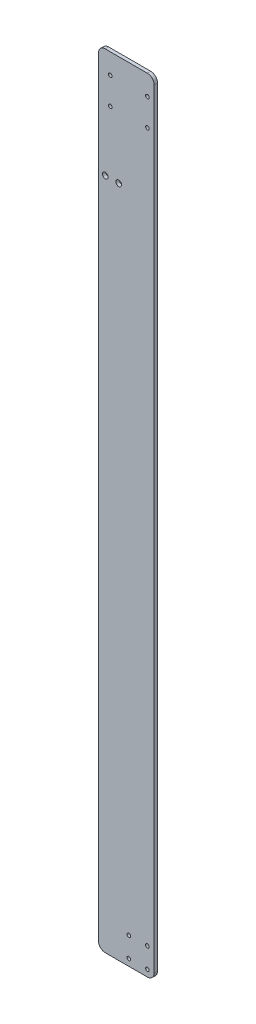
ISO-10303-21;
HEADER;
FILE_DESCRIPTION(('STEP AP214'),'2;1');
FILE_NAME('part.step','',(''),(''),'','','');
FILE_SCHEMA(('AUTOMOTIVE_DESIGN { 1 0 10303 214 1 1 1 1 }'));
ENDSEC;
DATA;
#1=APPLICATION_CONTEXT('core data for automotive mechanical design processes');
#2=APPLICATION_PROTOCOL_DEFINITION('international standard','automotive_design',2000,#1);
#3=PRODUCT_CONTEXT('',#1,'mechanical');
#4=PRODUCT('Part','Part','',(#3));
#5=PRODUCT_RELATED_PRODUCT_CATEGORY('part','',(#4));
#6=PRODUCT_DEFINITION_FORMATION('','',#4);
#7=PRODUCT_DEFINITION_CONTEXT('part definition',#1,'design');
#8=PRODUCT_DEFINITION('design','',#6,#7);
#9=PRODUCT_DEFINITION_SHAPE('','',#8);
#10=(LENGTH_UNIT() NAMED_UNIT(*) SI_UNIT(.MILLI.,.METRE.));
#11=(NAMED_UNIT(*) PLANE_ANGLE_UNIT() SI_UNIT($,.RADIAN.));
#12=(NAMED_UNIT(*) SI_UNIT($,.STERADIAN.) SOLID_ANGLE_UNIT());
#13=UNCERTAINTY_MEASURE_WITH_UNIT(LENGTH_MEASURE(1.E-05),#10,'distance_accuracy_value','');
#14=(GEOMETRIC_REPRESENTATION_CONTEXT(3) GLOBAL_UNCERTAINTY_ASSIGNED_CONTEXT((#13)) GLOBAL_UNIT_ASSIGNED_CONTEXT((#10,
#11,#12)) REPRESENTATION_CONTEXT('',''));
#15=CARTESIAN_POINT('',(0.,0.,0.));
#16=DIRECTION('',(0.,0.,1.));
#17=DIRECTION('',(1.,0.,0.));
#18=AXIS2_PLACEMENT_3D('',#15,#16,#17);
#19=CARTESIAN_POINT('',(12.7,1460.5,6.35));
#20=DIRECTION('',(0.,0.,-1.));
#21=DIRECTION('',(-1.,0.,0.));
#22=AXIS2_PLACEMENT_3D('',#19,#20,#21);
#23=PLANE('',#22);
#24=CARTESIAN_POINT('',(12.7,1460.5,6.35));
#25=DIRECTION('',(0.,0.,1.));
#26=DIRECTION('',(-1.,0.,0.));
#27=AXIS2_PLACEMENT_3D('',#24,#25,#26);
#28=CIRCLE('',#27,12.7);
#29=CARTESIAN_POINT('',(12.7,1473.2,6.35));
#30=VERTEX_POINT('',#29);
#31=CARTESIAN_POINT('',(0.,1460.5,6.35));
#32=VERTEX_POINT('',#31);
#33=EDGE_CURVE('E147',#30,#32,#28,.T.);
#34=ORIENTED_EDGE('',*,*,#33,.T.);
#35=DIRECTION('',(0.,-1.,0.));
#36=VECTOR('',#35,1.);
#37=CARTESIAN_POINT('',(0.,12.7000000000001,6.35));
#38=LINE('',#37,#36);
#39=CARTESIAN_POINT('',(0.,12.7000000000001,6.35));
#40=VERTEX_POINT('',#39);
#41=EDGE_CURVE('E95',#32,#40,#38,.T.);
#42=ORIENTED_EDGE('',*,*,#41,.T.);
#43=CARTESIAN_POINT('',(12.7,12.7,6.35));
#44=DIRECTION('',(0.,0.,1.));
#45=DIRECTION('',(-1.,0.,0.));
#46=AXIS2_PLACEMENT_3D('',#43,#44,#45);
#47=CIRCLE('',#46,12.7);
#48=CARTESIAN_POINT('',(12.7000000000001,0.,6.35));
#49=VERTEX_POINT('',#48);
#50=EDGE_CURVE('E162',#40,#49,#47,.T.);
#51=ORIENTED_EDGE('',*,*,#50,.T.);
#52=DIRECTION('',(1.,0.,0.));
#53=VECTOR('',#52,1.);
#54=CARTESIAN_POINT('',(12.7000000000001,0.,6.35));
#55=LINE('',#54,#53);
#56=CARTESIAN_POINT('',(92.0749999999999,0.,6.35));
#57=VERTEX_POINT('',#56);
#58=EDGE_CURVE('E175',#49,#57,#55,.T.);
#59=ORIENTED_EDGE('',*,*,#58,.T.);
#60=CARTESIAN_POINT('',(92.075,12.7,6.35));
#61=DIRECTION('',(0.,0.,1.));
#62=DIRECTION('',(1.,0.,0.));
#63=AXIS2_PLACEMENT_3D('',#60,#61,#62);
#64=CIRCLE('',#63,12.7);
#65=CARTESIAN_POINT('',(104.775,12.7,6.35));
#66=VERTEX_POINT('',#65);
#67=EDGE_CURVE('E114',#57,#66,#64,.T.);
#68=ORIENTED_EDGE('',*,*,#67,.T.);
#69=DIRECTION('',(0.,1.,0.));
#70=VECTOR('',#69,1.);
#71=CARTESIAN_POINT('',(104.775,12.7000000000001,6.35));
#72=LINE('',#71,#70);
#73=CARTESIAN_POINT('',(104.775,1460.5,6.35));
#74=VERTEX_POINT('',#73);
#75=EDGE_CURVE('E108',#66,#74,#72,.T.);
#76=ORIENTED_EDGE('',*,*,#75,.T.);
#77=CARTESIAN_POINT('',(92.075,1460.5,6.35));
#78=DIRECTION('',(0.,0.,1.));
#79=DIRECTION('',(-1.,0.,0.));
#80=AXIS2_PLACEMENT_3D('',#77,#78,#79);
#81=CIRCLE('',#80,12.7);
#82=CARTESIAN_POINT('',(92.075,1473.2,6.35));
#83=VERTEX_POINT('',#82);
#84=EDGE_CURVE('E112',#74,#83,#81,.T.);
#85=ORIENTED_EDGE('',*,*,#84,.T.);
#86=DIRECTION('',(-1.,0.,0.));
#87=VECTOR('',#86,1.);
#88=CARTESIAN_POINT('',(12.7,1473.2,6.35));
#89=LINE('',#88,#87);
#90=EDGE_CURVE('E52',#83,#30,#89,.T.);
#91=ORIENTED_EDGE('',*,*,#90,.T.);
#92=EDGE_LOOP('',(#34,#42,#51,#59,#68,#76,#85,#91));
#93=FACE_BOUND('',#92,.T.);
#94=CARTESIAN_POINT('',(92.075,1435.1,6.35));
#95=DIRECTION('',(0.,0.,1.));
#96=DIRECTION('',(1.,0.,0.));
#97=AXIS2_PLACEMENT_3D('',#94,#95,#96);
#98=CIRCLE('',#97,3.429);
#99=CARTESIAN_POINT('',(95.504,1435.1,6.35));
#100=VERTEX_POINT('',#99);
#101=EDGE_CURVE('E136',#100,#100,#98,.T.);
#102=ORIENTED_EDGE('',*,*,#101,.F.);
#103=EDGE_LOOP('',(#102));
#104=FACE_BOUND('',#103,.T.);
#105=CARTESIAN_POINT('',(92.075,1384.3,6.35));
#106=DIRECTION('',(0.,0.,1.));
#107=DIRECTION('',(1.,0.,0.));
#108=AXIS2_PLACEMENT_3D('',#105,#106,#107);
#109=CIRCLE('',#108,3.429);
#110=CARTESIAN_POINT('',(95.504,1384.3,6.35));
#111=VERTEX_POINT('',#110);
#112=EDGE_CURVE('E184',#111,#111,#109,.T.);
#113=ORIENTED_EDGE('',*,*,#112,.F.);
#114=EDGE_LOOP('',(#113));
#115=FACE_BOUND('',#114,.T.);
#116=CARTESIAN_POINT('',(22.225,1384.3,6.35));
#117=DIRECTION('',(0.,0.,1.));
#118=DIRECTION('',(1.,0.,0.));
#119=AXIS2_PLACEMENT_3D('',#116,#117,#118);
#120=CIRCLE('',#119,3.429);
#121=CARTESIAN_POINT('',(25.654,1384.3,6.35));
#122=VERTEX_POINT('',#121);
#123=EDGE_CURVE('E190',#122,#122,#120,.T.);
#124=ORIENTED_EDGE('',*,*,#123,.F.);
#125=EDGE_LOOP('',(#124));
#126=FACE_BOUND('',#125,.T.);
#127=CARTESIAN_POINT('',(22.225,1435.1,6.35));
#128=DIRECTION('',(0.,0.,1.));
#129=DIRECTION('',(1.,0.,0.));
#130=AXIS2_PLACEMENT_3D('',#127,#128,#129);
#131=CIRCLE('',#130,3.429);
#132=CARTESIAN_POINT('',(25.654,1435.1,6.35));
#133=VERTEX_POINT('',#132);
#134=EDGE_CURVE('E196',#133,#133,#131,.T.);
#135=ORIENTED_EDGE('',*,*,#134,.F.);
#136=EDGE_LOOP('',(#135));
#137=FACE_BOUND('',#136,.T.);
#138=CARTESIAN_POINT('',(57.15,50.7999999999998,6.35));
#139=DIRECTION('',(0.,0.,1.));
#140=DIRECTION('',(1.,0.,0.));
#141=AXIS2_PLACEMENT_3D('',#138,#139,#140);
#142=CIRCLE('',#141,3.429);
#143=CARTESIAN_POINT('',(60.579,50.7999999999998,6.35));
#144=VERTEX_POINT('',#143);
#145=EDGE_CURVE('E202',#144,#144,#142,.T.);
#146=ORIENTED_EDGE('',*,*,#145,.F.);
#147=EDGE_LOOP('',(#146));
#148=FACE_BOUND('',#147,.T.);
#149=CARTESIAN_POINT('',(92.075,50.8,6.35));
#150=DIRECTION('',(0.,0.,1.));
#151=DIRECTION('',(1.,0.,0.));
#152=AXIS2_PLACEMENT_3D('',#149,#150,#151);
#153=CIRCLE('',#152,3.429);
#154=CARTESIAN_POINT('',(95.504,50.8,6.35));
#155=VERTEX_POINT('',#154);
#156=EDGE_CURVE('E208',#155,#155,#153,.T.);
#157=ORIENTED_EDGE('',*,*,#156,.F.);
#158=EDGE_LOOP('',(#157));
#159=FACE_BOUND('',#158,.T.);
#160=CARTESIAN_POINT('',(57.15,12.7,6.35));
#161=DIRECTION('',(0.,0.,1.));
#162=DIRECTION('',(1.,0.,0.));
#163=AXIS2_PLACEMENT_3D('',#160,#161,#162);
#164=CIRCLE('',#163,3.42899999999999);
#165=CARTESIAN_POINT('',(60.579,12.7,6.35));
#166=VERTEX_POINT('',#165);
#167=EDGE_CURVE('E214',#166,#166,#164,.T.);
#168=ORIENTED_EDGE('',*,*,#167,.F.);
#169=EDGE_LOOP('',(#168));
#170=FACE_BOUND('',#169,.T.);
#171=CARTESIAN_POINT('',(92.075,12.7,6.35));
#172=DIRECTION('',(0.,0.,1.));
#173=DIRECTION('',(1.,0.,0.));
#174=AXIS2_PLACEMENT_3D('',#171,#172,#173);
#175=CIRCLE('',#174,3.429);
#176=CARTESIAN_POINT('',(95.504,12.7,6.35));
#177=VERTEX_POINT('',#176);
#178=EDGE_CURVE('E220',#177,#177,#175,.T.);
#179=ORIENTED_EDGE('',*,*,#178,.F.);
#180=EDGE_LOOP('',(#179));
#181=FACE_BOUND('',#180,.T.);
#182=CARTESIAN_POINT('',(38.1,1266.825,6.35));
#183=DIRECTION('',(0.,0.,1.));
#184=DIRECTION('',(1.,0.,0.));
#185=AXIS2_PLACEMENT_3D('',#182,#183,#184);
#186=CIRCLE('',#185,5.3578124999999);
#187=CARTESIAN_POINT('',(43.4578124999999,1266.825,6.35));
#188=VERTEX_POINT('',#187);
#189=EDGE_CURVE('E226',#188,#188,#186,.T.);
#190=ORIENTED_EDGE('',*,*,#189,.F.);
#191=EDGE_LOOP('',(#190));
#192=FACE_BOUND('',#191,.T.);
#193=CARTESIAN_POINT('',(12.7,1266.825,6.35));
#194=DIRECTION('',(0.,0.,1.));
#195=DIRECTION('',(1.,0.,0.));
#196=AXIS2_PLACEMENT_3D('',#193,#194,#195);
#197=CIRCLE('',#196,5.35781249999991);
#198=CARTESIAN_POINT('',(18.0578124999999,1266.825,6.35));
#199=VERTEX_POINT('',#198);
#200=EDGE_CURVE('E232',#199,#199,#197,.T.);
#201=ORIENTED_EDGE('',*,*,#200,.F.);
#202=EDGE_LOOP('',(#201));
#203=FACE_BOUND('',#202,.T.);
#204=ADVANCED_FACE('F35',(#93,#104,#115,#126,#137,#148,#159,#170,#181,#192,#203),#23,.F.);
#205=CARTESIAN_POINT('',(12.7,1460.5,0.));
#206=DIRECTION('',(0.,0.,-1.));
#207=DIRECTION('',(-1.,0.,0.));
#208=AXIS2_PLACEMENT_3D('',#205,#206,#207);
#209=PLANE('',#208);
#210=CARTESIAN_POINT('',(38.1,1266.825,0.));
#211=DIRECTION('',(0.,0.,1.));
#212=DIRECTION('',(1.,0.,0.));
#213=AXIS2_PLACEMENT_3D('',#210,#211,#212);
#214=CIRCLE('',#213,5.3578124999999);
#215=CARTESIAN_POINT('',(43.4578124999999,1266.825,0.));
#216=VERTEX_POINT('',#215);
#217=EDGE_CURVE('E229',#216,#216,#214,.T.);
#218=ORIENTED_EDGE('',*,*,#217,.T.);
#219=EDGE_LOOP('',(#218));
#220=FACE_BOUND('',#219,.T.);
#221=CARTESIAN_POINT('',(57.15,12.7,0.));
#222=DIRECTION('',(0.,0.,1.));
#223=DIRECTION('',(1.,0.,0.));
#224=AXIS2_PLACEMENT_3D('',#221,#222,#223);
#225=CIRCLE('',#224,3.42899999999999);
#226=CARTESIAN_POINT('',(60.579,12.7,0.));
#227=VERTEX_POINT('',#226);
#228=EDGE_CURVE('E217',#227,#227,#225,.T.);
#229=ORIENTED_EDGE('',*,*,#228,.T.);
#230=EDGE_LOOP('',(#229));
#231=FACE_BOUND('',#230,.T.);
#232=CARTESIAN_POINT('',(57.15,50.7999999999998,0.));
#233=DIRECTION('',(0.,0.,1.));
#234=DIRECTION('',(1.,0.,0.));
#235=AXIS2_PLACEMENT_3D('',#232,#233,#234);
#236=CIRCLE('',#235,3.429);
#237=CARTESIAN_POINT('',(60.579,50.7999999999998,0.));
#238=VERTEX_POINT('',#237);
#239=EDGE_CURVE('E205',#238,#238,#236,.T.);
#240=ORIENTED_EDGE('',*,*,#239,.T.);
#241=EDGE_LOOP('',(#240));
#242=FACE_BOUND('',#241,.T.);
#243=CARTESIAN_POINT('',(22.225,1384.3,0.));
#244=DIRECTION('',(0.,0.,1.));
#245=DIRECTION('',(1.,0.,0.));
#246=AXIS2_PLACEMENT_3D('',#243,#244,#245);
#247=CIRCLE('',#246,3.429);
#248=CARTESIAN_POINT('',(25.654,1384.3,0.));
#249=VERTEX_POINT('',#248);
#250=EDGE_CURVE('E193',#249,#249,#247,.T.);
#251=ORIENTED_EDGE('',*,*,#250,.T.);
#252=EDGE_LOOP('',(#251));
#253=FACE_BOUND('',#252,.T.);
#254=CARTESIAN_POINT('',(92.075,1435.1,0.));
#255=DIRECTION('',(0.,0.,1.));
#256=DIRECTION('',(1.,0.,0.));
#257=AXIS2_PLACEMENT_3D('',#254,#255,#256);
#258=CIRCLE('',#257,3.429);
#259=CARTESIAN_POINT('',(95.504,1435.1,0.));
#260=VERTEX_POINT('',#259);
#261=EDGE_CURVE('E181',#260,#260,#258,.T.);
#262=ORIENTED_EDGE('',*,*,#261,.T.);
#263=EDGE_LOOP('',(#262));
#264=FACE_BOUND('',#263,.T.);
#265=CARTESIAN_POINT('',(12.7,1460.5,0.));
#266=DIRECTION('',(0.,0.,1.));
#267=DIRECTION('',(-1.,0.,0.));
#268=AXIS2_PLACEMENT_3D('',#265,#266,#267);
#269=CIRCLE('',#268,12.7);
#270=CARTESIAN_POINT('',(12.7,1473.2,0.));
#271=VERTEX_POINT('',#270);
#272=CARTESIAN_POINT('',(0.,1460.5,0.));
#273=VERTEX_POINT('',#272);
#274=EDGE_CURVE('E132',#271,#273,#269,.T.);
#275=ORIENTED_EDGE('',*,*,#274,.F.);
#276=DIRECTION('',(-1.,0.,0.));
#277=VECTOR('',#276,1.);
#278=CARTESIAN_POINT('',(12.7,1473.2,0.));
#279=LINE('',#278,#277);
#280=CARTESIAN_POINT('',(92.075,1473.2,0.));
#281=VERTEX_POINT('',#280);
#282=EDGE_CURVE('E87',#281,#271,#279,.T.);
#283=ORIENTED_EDGE('',*,*,#282,.F.);
#284=CARTESIAN_POINT('',(92.075,1460.5,0.));
#285=DIRECTION('',(0.,0.,1.));
#286=DIRECTION('',(-1.,0.,0.));
#287=AXIS2_PLACEMENT_3D('',#284,#285,#286);
#288=CIRCLE('',#287,12.7);
#289=CARTESIAN_POINT('',(104.775,1460.5,0.));
#290=VERTEX_POINT('',#289);
#291=EDGE_CURVE('E81',#290,#281,#288,.T.);
#292=ORIENTED_EDGE('',*,*,#291,.F.);
#293=DIRECTION('',(0.,1.,0.));
#294=VECTOR('',#293,1.);
#295=CARTESIAN_POINT('',(104.775,12.7000000000001,0.));
#296=LINE('',#295,#294);
#297=CARTESIAN_POINT('',(104.775,12.7,0.));
#298=VERTEX_POINT('',#297);
#299=EDGE_CURVE('E122',#298,#290,#296,.T.);
#300=ORIENTED_EDGE('',*,*,#299,.F.);
#301=CARTESIAN_POINT('',(92.075,12.7,0.));
#302=DIRECTION('',(0.,0.,1.));
#303=DIRECTION('',(1.,0.,0.));
#304=AXIS2_PLACEMENT_3D('',#301,#302,#303);
#305=CIRCLE('',#304,12.7);
#306=CARTESIAN_POINT('',(92.0749999999999,0.,0.));
#307=VERTEX_POINT('',#306);
#308=EDGE_CURVE('E142',#307,#298,#305,.T.);
#309=ORIENTED_EDGE('',*,*,#308,.F.);
#310=DIRECTION('',(1.,0.,0.));
#311=VECTOR('',#310,1.);
#312=CARTESIAN_POINT('',(12.7000000000001,0.,0.));
#313=LINE('',#312,#311);
#314=CARTESIAN_POINT('',(12.7000000000001,0.,0.));
#315=VERTEX_POINT('',#314);
#316=EDGE_CURVE('E140',#315,#307,#313,.T.);
#317=ORIENTED_EDGE('',*,*,#316,.F.);
#318=CARTESIAN_POINT('',(12.7,12.7,0.));
#319=DIRECTION('',(0.,0.,1.));
#320=DIRECTION('',(-1.,0.,0.));
#321=AXIS2_PLACEMENT_3D('',#318,#319,#320);
#322=CIRCLE('',#321,12.7);
#323=CARTESIAN_POINT('',(0.,12.7000000000001,0.));
#324=VERTEX_POINT('',#323);
#325=EDGE_CURVE('E138',#324,#315,#322,.T.);
#326=ORIENTED_EDGE('',*,*,#325,.F.);
#327=DIRECTION('',(0.,-1.,0.));
#328=VECTOR('',#327,1.);
#329=CARTESIAN_POINT('',(0.,12.7000000000001,0.));
#330=LINE('',#329,#328);
#331=EDGE_CURVE('E135',#273,#324,#330,.T.);
#332=ORIENTED_EDGE('',*,*,#331,.F.);
#333=EDGE_LOOP('',(#275,#283,#292,#300,#309,#317,#326,#332));
#334=FACE_BOUND('',#333,.T.);
#335=CARTESIAN_POINT('',(92.075,1384.3,0.));
#336=DIRECTION('',(0.,0.,1.));
#337=DIRECTION('',(1.,0.,0.));
#338=AXIS2_PLACEMENT_3D('',#335,#336,#337);
#339=CIRCLE('',#338,3.429);
#340=CARTESIAN_POINT('',(95.504,1384.3,0.));
#341=VERTEX_POINT('',#340);
#342=EDGE_CURVE('E187',#341,#341,#339,.T.);
#343=ORIENTED_EDGE('',*,*,#342,.T.);
#344=EDGE_LOOP('',(#343));
#345=FACE_BOUND('',#344,.T.);
#346=CARTESIAN_POINT('',(22.225,1435.1,0.));
#347=DIRECTION('',(0.,0.,1.));
#348=DIRECTION('',(1.,0.,0.));
#349=AXIS2_PLACEMENT_3D('',#346,#347,#348);
#350=CIRCLE('',#349,3.429);
#351=CARTESIAN_POINT('',(25.654,1435.1,0.));
#352=VERTEX_POINT('',#351);
#353=EDGE_CURVE('E199',#352,#352,#350,.T.);
#354=ORIENTED_EDGE('',*,*,#353,.T.);
#355=EDGE_LOOP('',(#354));
#356=FACE_BOUND('',#355,.T.);
#357=CARTESIAN_POINT('',(92.075,50.8,0.));
#358=DIRECTION('',(0.,0.,1.));
#359=DIRECTION('',(1.,0.,0.));
#360=AXIS2_PLACEMENT_3D('',#357,#358,#359);
#361=CIRCLE('',#360,3.429);
#362=CARTESIAN_POINT('',(95.504,50.8,0.));
#363=VERTEX_POINT('',#362);
#364=EDGE_CURVE('E211',#363,#363,#361,.T.);
#365=ORIENTED_EDGE('',*,*,#364,.T.);
#366=EDGE_LOOP('',(#365));
#367=FACE_BOUND('',#366,.T.);
#368=CARTESIAN_POINT('',(92.075,12.7,0.));
#369=DIRECTION('',(0.,0.,1.));
#370=DIRECTION('',(1.,0.,0.));
#371=AXIS2_PLACEMENT_3D('',#368,#369,#370);
#372=CIRCLE('',#371,3.429);
#373=CARTESIAN_POINT('',(95.504,12.7,0.));
#374=VERTEX_POINT('',#373);
#375=EDGE_CURVE('E223',#374,#374,#372,.T.);
#376=ORIENTED_EDGE('',*,*,#375,.T.);
#377=EDGE_LOOP('',(#376));
#378=FACE_BOUND('',#377,.T.);
#379=CARTESIAN_POINT('',(12.7,1266.825,0.));
#380=DIRECTION('',(0.,0.,1.));
#381=DIRECTION('',(1.,0.,0.));
#382=AXIS2_PLACEMENT_3D('',#379,#380,#381);
#383=CIRCLE('',#382,5.35781249999991);
#384=CARTESIAN_POINT('',(18.0578124999999,1266.825,0.));
#385=VERTEX_POINT('',#384);
#386=EDGE_CURVE('E235',#385,#385,#383,.T.);
#387=ORIENTED_EDGE('',*,*,#386,.T.);
#388=EDGE_LOOP('',(#387));
#389=FACE_BOUND('',#388,.T.);
#390=ADVANCED_FACE('F166',(#220,#231,#242,#253,#264,#334,#345,#356,#367,#378,#389),#209,.T.);
#391=CARTESIAN_POINT('',(12.7,1460.5,6.35));
#392=DIRECTION('',(0.,0.,-1.));
#393=DIRECTION('',(-1.,0.,0.));
#394=AXIS2_PLACEMENT_3D('',#391,#392,#393);
#395=CYLINDRICAL_SURFACE('',#394,12.7);
#396=ORIENTED_EDGE('',*,*,#274,.T.);
#397=DIRECTION('',(0.,0.,-1.));
#398=VECTOR('',#397,1.);
#399=CARTESIAN_POINT('',(0.,1460.5,6.35));
#400=LINE('',#399,#398);
#401=EDGE_CURVE('E11',#32,#273,#400,.T.);
#402=ORIENTED_EDGE('',*,*,#401,.F.);
#403=ORIENTED_EDGE('',*,*,#33,.F.);
#404=DIRECTION('',(0.,0.,-1.));
#405=VECTOR('',#404,1.);
#406=CARTESIAN_POINT('',(12.7,1473.2,6.35));
#407=LINE('',#406,#405);
#408=EDGE_CURVE('E128',#30,#271,#407,.T.);
#409=ORIENTED_EDGE('',*,*,#408,.T.);
#410=EDGE_LOOP('',(#396,#402,#403,#409));
#411=FACE_BOUND('',#410,.T.);
#412=ADVANCED_FACE('F37',(#411),#395,.T.);
#413=CARTESIAN_POINT('',(0.,12.7000000000001,6.35));
#414=DIRECTION('',(1.,0.,0.));
#415=DIRECTION('',(0.,0.,-1.));
#416=AXIS2_PLACEMENT_3D('',#413,#414,#415);
#417=PLANE('',#416);
#418=ORIENTED_EDGE('',*,*,#331,.T.);
#419=DIRECTION('',(0.,0.,-1.));
#420=VECTOR('',#419,1.);
#421=CARTESIAN_POINT('',(0.,12.7000000000001,6.35));
#422=LINE('',#421,#420);
#423=EDGE_CURVE('E44',#40,#324,#422,.T.);
#424=ORIENTED_EDGE('',*,*,#423,.F.);
#425=ORIENTED_EDGE('',*,*,#41,.F.);
#426=ORIENTED_EDGE('',*,*,#401,.T.);
#427=EDGE_LOOP('',(#418,#424,#425,#426));
#428=FACE_BOUND('',#427,.T.);
#429=ADVANCED_FACE('F267',(#428),#417,.F.);
#430=CARTESIAN_POINT('',(12.7,12.7,6.35));
#431=DIRECTION('',(0.,0.,-1.));
#432=DIRECTION('',(-1.,0.,0.));
#433=AXIS2_PLACEMENT_3D('',#430,#431,#432);
#434=CYLINDRICAL_SURFACE('',#433,12.7);
#435=ORIENTED_EDGE('',*,*,#325,.T.);
#436=DIRECTION('',(0.,0.,-1.));
#437=VECTOR('',#436,1.);
#438=CARTESIAN_POINT('',(12.7000000000001,0.,6.35));
#439=LINE('',#438,#437);
#440=EDGE_CURVE('E154',#49,#315,#439,.T.);
#441=ORIENTED_EDGE('',*,*,#440,.F.);
#442=ORIENTED_EDGE('',*,*,#50,.F.);
#443=ORIENTED_EDGE('',*,*,#423,.T.);
#444=EDGE_LOOP('',(#435,#441,#442,#443));
#445=FACE_BOUND('',#444,.T.);
#446=ADVANCED_FACE('F160',(#445),#434,.T.);
#447=CARTESIAN_POINT('',(12.7000000000001,0.,6.35));
#448=DIRECTION('',(0.,1.,0.));
#449=DIRECTION('',(0.,0.,1.));
#450=AXIS2_PLACEMENT_3D('',#447,#448,#449);
#451=PLANE('',#450);
#452=ORIENTED_EDGE('',*,*,#316,.T.);
#453=DIRECTION('',(0.,0.,-1.));
#454=VECTOR('',#453,1.);
#455=CARTESIAN_POINT('',(92.0749999999999,0.,6.35));
#456=LINE('',#455,#454);
#457=EDGE_CURVE('E151',#57,#307,#456,.T.);
#458=ORIENTED_EDGE('',*,*,#457,.F.);
#459=ORIENTED_EDGE('',*,*,#58,.F.);
#460=ORIENTED_EDGE('',*,*,#440,.T.);
#461=EDGE_LOOP('',(#452,#458,#459,#460));
#462=FACE_BOUND('',#461,.T.);
#463=ADVANCED_FACE('F171',(#462),#451,.F.);
#464=CARTESIAN_POINT('',(92.075,12.7,6.35));
#465=DIRECTION('',(0.,0.,-1.));
#466=DIRECTION('',(-1.,0.,0.));
#467=AXIS2_PLACEMENT_3D('',#464,#465,#466);
#468=CYLINDRICAL_SURFACE('',#467,12.7);
#469=ORIENTED_EDGE('',*,*,#308,.T.);
#470=DIRECTION('',(0.,0.,-1.));
#471=VECTOR('',#470,1.);
#472=CARTESIAN_POINT('',(104.775,12.7,6.35));
#473=LINE('',#472,#471);
#474=EDGE_CURVE('E123',#66,#298,#473,.T.);
#475=ORIENTED_EDGE('',*,*,#474,.F.);
#476=ORIENTED_EDGE('',*,*,#67,.F.);
#477=ORIENTED_EDGE('',*,*,#457,.T.);
#478=EDGE_LOOP('',(#469,#475,#476,#477));
#479=FACE_BOUND('',#478,.T.);
#480=ADVANCED_FACE('F174',(#479),#468,.T.);
#481=CARTESIAN_POINT('',(104.775,12.7000000000001,6.35));
#482=DIRECTION('',(-1.,0.,0.));
#483=DIRECTION('',(0.,0.,1.));
#484=AXIS2_PLACEMENT_3D('',#481,#482,#483);
#485=PLANE('',#484);
#486=ORIENTED_EDGE('',*,*,#299,.T.);
#487=DIRECTION('',(0.,0.,-1.));
#488=VECTOR('',#487,1.);
#489=CARTESIAN_POINT('',(104.775,1460.5,6.35));
#490=LINE('',#489,#488);
#491=EDGE_CURVE('E119',#74,#290,#490,.T.);
#492=ORIENTED_EDGE('',*,*,#491,.F.);
#493=ORIENTED_EDGE('',*,*,#75,.F.);
#494=ORIENTED_EDGE('',*,*,#474,.T.);
#495=EDGE_LOOP('',(#486,#492,#493,#494));
#496=FACE_BOUND('',#495,.T.);
#497=ADVANCED_FACE('F120',(#496),#485,.F.);
#498=CARTESIAN_POINT('',(92.075,1460.5,6.35));
#499=DIRECTION('',(0.,0.,-1.));
#500=DIRECTION('',(-1.,0.,0.));
#501=AXIS2_PLACEMENT_3D('',#498,#499,#500);
#502=CYLINDRICAL_SURFACE('',#501,12.7);
#503=ORIENTED_EDGE('',*,*,#291,.T.);
#504=DIRECTION('',(0.,0.,-1.));
#505=VECTOR('',#504,1.);
#506=CARTESIAN_POINT('',(92.075,1473.2,6.35));
#507=LINE('',#506,#505);
#508=EDGE_CURVE('E124',#83,#281,#507,.T.);
#509=ORIENTED_EDGE('',*,*,#508,.F.);
#510=ORIENTED_EDGE('',*,*,#84,.F.);
#511=ORIENTED_EDGE('',*,*,#491,.T.);
#512=EDGE_LOOP('',(#503,#509,#510,#511));
#513=FACE_BOUND('',#512,.T.);
#514=ADVANCED_FACE('F126',(#513),#502,.T.);
#515=CARTESIAN_POINT('',(12.7,1473.2,6.35));
#516=DIRECTION('',(0.,-1.,0.));
#517=DIRECTION('',(0.,0.,-1.));
#518=AXIS2_PLACEMENT_3D('',#515,#516,#517);
#519=PLANE('',#518);
#520=ORIENTED_EDGE('',*,*,#282,.T.);
#521=ORIENTED_EDGE('',*,*,#408,.F.);
#522=ORIENTED_EDGE('',*,*,#90,.F.);
#523=ORIENTED_EDGE('',*,*,#508,.T.);
#524=EDGE_LOOP('',(#520,#521,#522,#523));
#525=FACE_BOUND('',#524,.T.);
#526=ADVANCED_FACE('F255',(#525),#519,.F.);
#527=CARTESIAN_POINT('',(92.075,1435.1,6.35));
#528=DIRECTION('',(0.,0.,-1.));
#529=DIRECTION('',(-1.,0.,0.));
#530=AXIS2_PLACEMENT_3D('',#527,#528,#529);
#531=CYLINDRICAL_SURFACE('',#530,3.429);
#532=ORIENTED_EDGE('',*,*,#101,.T.);
#533=EDGE_LOOP('',(#532));
#534=FACE_BOUND('',#533,.T.);
#535=ORIENTED_EDGE('',*,*,#261,.F.);
#536=EDGE_LOOP('',(#535));
#537=FACE_BOUND('',#536,.T.);
#538=ADVANCED_FACE('F252',(#534,#537),#531,.F.);
#539=CARTESIAN_POINT('',(92.075,1384.3,6.35));
#540=DIRECTION('',(0.,0.,-1.));
#541=DIRECTION('',(-1.,0.,0.));
#542=AXIS2_PLACEMENT_3D('',#539,#540,#541);
#543=CYLINDRICAL_SURFACE('',#542,3.429);
#544=ORIENTED_EDGE('',*,*,#112,.T.);
#545=EDGE_LOOP('',(#544));
#546=FACE_BOUND('',#545,.T.);
#547=ORIENTED_EDGE('',*,*,#342,.F.);
#548=EDGE_LOOP('',(#547));
#549=FACE_BOUND('',#548,.T.);
#550=ADVANCED_FACE('F331',(#546,#549),#543,.F.);
#551=CARTESIAN_POINT('',(22.225,1384.3,6.35));
#552=DIRECTION('',(0.,0.,-1.));
#553=DIRECTION('',(-1.,0.,0.));
#554=AXIS2_PLACEMENT_3D('',#551,#552,#553);
#555=CYLINDRICAL_SURFACE('',#554,3.429);
#556=ORIENTED_EDGE('',*,*,#123,.T.);
#557=EDGE_LOOP('',(#556));
#558=FACE_BOUND('',#557,.T.);
#559=ORIENTED_EDGE('',*,*,#250,.F.);
#560=EDGE_LOOP('',(#559));
#561=FACE_BOUND('',#560,.T.);
#562=ADVANCED_FACE('F339',(#558,#561),#555,.F.);
#563=CARTESIAN_POINT('',(22.225,1435.1,6.35));
#564=DIRECTION('',(0.,0.,-1.));
#565=DIRECTION('',(-1.,0.,0.));
#566=AXIS2_PLACEMENT_3D('',#563,#564,#565);
#567=CYLINDRICAL_SURFACE('',#566,3.429);
#568=ORIENTED_EDGE('',*,*,#134,.T.);
#569=EDGE_LOOP('',(#568));
#570=FACE_BOUND('',#569,.T.);
#571=ORIENTED_EDGE('',*,*,#353,.F.);
#572=EDGE_LOOP('',(#571));
#573=FACE_BOUND('',#572,.T.);
#574=ADVANCED_FACE('F347',(#570,#573),#567,.F.);
#575=CARTESIAN_POINT('',(57.15,50.7999999999998,6.35));
#576=DIRECTION('',(0.,0.,-1.));
#577=DIRECTION('',(-1.,0.,0.));
#578=AXIS2_PLACEMENT_3D('',#575,#576,#577);
#579=CYLINDRICAL_SURFACE('',#578,3.429);
#580=ORIENTED_EDGE('',*,*,#145,.T.);
#581=EDGE_LOOP('',(#580));
#582=FACE_BOUND('',#581,.T.);
#583=ORIENTED_EDGE('',*,*,#239,.F.);
#584=EDGE_LOOP('',(#583));
#585=FACE_BOUND('',#584,.T.);
#586=ADVANCED_FACE('F356',(#582,#585),#579,.F.);
#587=CARTESIAN_POINT('',(92.075,50.8,6.35));
#588=DIRECTION('',(0.,0.,-1.));
#589=DIRECTION('',(-1.,0.,0.));
#590=AXIS2_PLACEMENT_3D('',#587,#588,#589);
#591=CYLINDRICAL_SURFACE('',#590,3.429);
#592=ORIENTED_EDGE('',*,*,#156,.T.);
#593=EDGE_LOOP('',(#592));
#594=FACE_BOUND('',#593,.T.);
#595=ORIENTED_EDGE('',*,*,#364,.F.);
#596=EDGE_LOOP('',(#595));
#597=FACE_BOUND('',#596,.T.);
#598=ADVANCED_FACE('F365',(#594,#597),#591,.F.);
#599=CARTESIAN_POINT('',(57.15,12.7,6.35));
#600=DIRECTION('',(0.,0.,-1.));
#601=DIRECTION('',(-1.,0.,0.));
#602=AXIS2_PLACEMENT_3D('',#599,#600,#601);
#603=CYLINDRICAL_SURFACE('',#602,3.42899999999999);
#604=ORIENTED_EDGE('',*,*,#167,.T.);
#605=EDGE_LOOP('',(#604));
#606=FACE_BOUND('',#605,.T.);
#607=ORIENTED_EDGE('',*,*,#228,.F.);
#608=EDGE_LOOP('',(#607));
#609=FACE_BOUND('',#608,.T.);
#610=ADVANCED_FACE('F374',(#606,#609),#603,.F.);
#611=CARTESIAN_POINT('',(92.075,12.7,6.35));
#612=DIRECTION('',(0.,0.,-1.));
#613=DIRECTION('',(-1.,0.,0.));
#614=AXIS2_PLACEMENT_3D('',#611,#612,#613);
#615=CYLINDRICAL_SURFACE('',#614,3.429);
#616=ORIENTED_EDGE('',*,*,#178,.T.);
#617=EDGE_LOOP('',(#616));
#618=FACE_BOUND('',#617,.T.);
#619=ORIENTED_EDGE('',*,*,#375,.F.);
#620=EDGE_LOOP('',(#619));
#621=FACE_BOUND('',#620,.T.);
#622=ADVANCED_FACE('F383',(#618,#621),#615,.F.);
#623=CARTESIAN_POINT('',(38.1,1266.825,6.35));
#624=DIRECTION('',(0.,0.,-1.));
#625=DIRECTION('',(-1.,0.,0.));
#626=AXIS2_PLACEMENT_3D('',#623,#624,#625);
#627=CYLINDRICAL_SURFACE('',#626,5.3578124999999);
#628=ORIENTED_EDGE('',*,*,#189,.T.);
#629=EDGE_LOOP('',(#628));
#630=FACE_BOUND('',#629,.T.);
#631=ORIENTED_EDGE('',*,*,#217,.F.);
#632=EDGE_LOOP('',(#631));
#633=FACE_BOUND('',#632,.T.);
#634=ADVANCED_FACE('F392',(#630,#633),#627,.F.);
#635=CARTESIAN_POINT('',(12.7,1266.825,6.35));
#636=DIRECTION('',(0.,0.,-1.));
#637=DIRECTION('',(-1.,0.,0.));
#638=AXIS2_PLACEMENT_3D('',#635,#636,#637);
#639=CYLINDRICAL_SURFACE('',#638,5.35781249999991);
#640=ORIENTED_EDGE('',*,*,#200,.T.);
#641=EDGE_LOOP('',(#640));
#642=FACE_BOUND('',#641,.T.);
#643=ORIENTED_EDGE('',*,*,#386,.F.);
#644=EDGE_LOOP('',(#643));
#645=FACE_BOUND('',#644,.T.);
#646=ADVANCED_FACE('F241',(#642,#645),#639,.F.);
#647=CLOSED_SHELL('',(#204,#390,#412,#429,#446,#463,#480,#497,#514,#526,#538,#550,#562,#574,
#586,#598,#610,#622,#634,#646));
#648=MANIFOLD_SOLID_BREP('B2',#647);
#649=ADVANCED_BREP_SHAPE_REPRESENTATION('',(#18,#648),#14);
#650=SHAPE_DEFINITION_REPRESENTATION(#9,#649);
ENDSEC;
END-ISO-10303-21;
